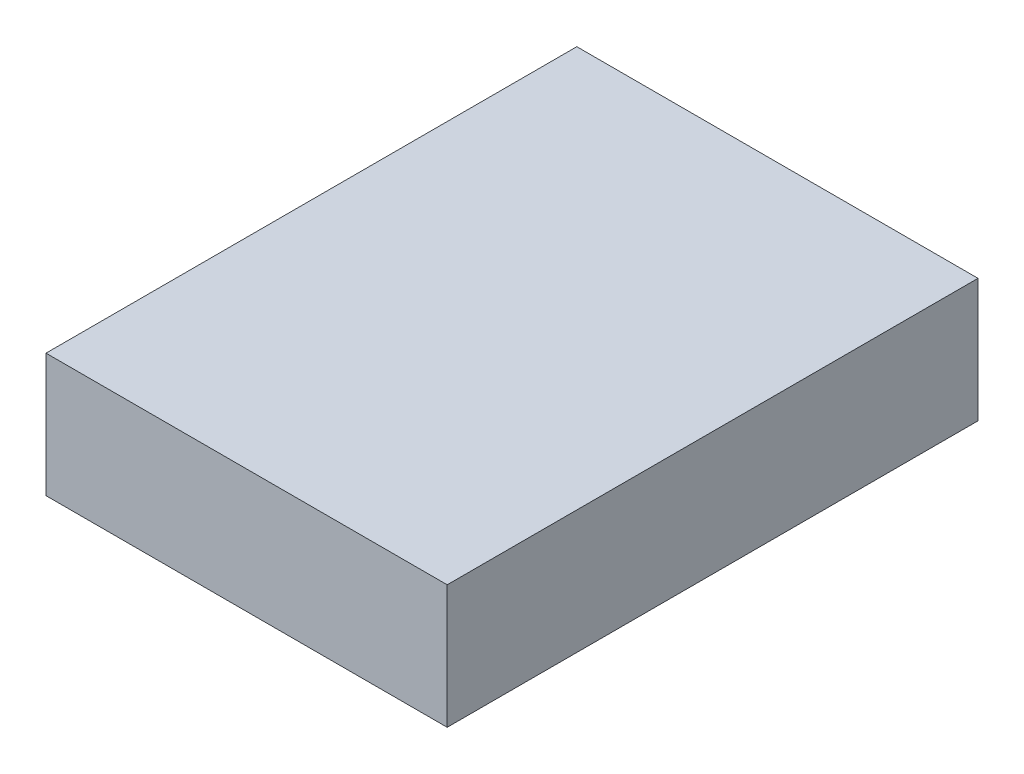
ISO-10303-21;
HEADER;
FILE_DESCRIPTION(('STEP AP214'),'2;1');
FILE_NAME('part.step','',(''),(''),'','','');
FILE_SCHEMA(('AUTOMOTIVE_DESIGN { 1 0 10303 214 1 1 1 1 }'));
ENDSEC;
DATA;
#1=APPLICATION_CONTEXT('core data for automotive mechanical design processes');
#2=APPLICATION_PROTOCOL_DEFINITION('international standard','automotive_design',2000,#1);
#3=PRODUCT_CONTEXT('',#1,'mechanical');
#4=PRODUCT('Part','Part','',(#3));
#5=PRODUCT_RELATED_PRODUCT_CATEGORY('part','',(#4));
#6=PRODUCT_DEFINITION_FORMATION('','',#4);
#7=PRODUCT_DEFINITION_CONTEXT('part definition',#1,'design');
#8=PRODUCT_DEFINITION('design','',#6,#7);
#9=PRODUCT_DEFINITION_SHAPE('','',#8);
#10=(LENGTH_UNIT() NAMED_UNIT(*) SI_UNIT(.MILLI.,.METRE.));
#11=(NAMED_UNIT(*) PLANE_ANGLE_UNIT() SI_UNIT($,.RADIAN.));
#12=(NAMED_UNIT(*) SI_UNIT($,.STERADIAN.) SOLID_ANGLE_UNIT());
#13=UNCERTAINTY_MEASURE_WITH_UNIT(LENGTH_MEASURE(1.E-05),#10,'distance_accuracy_value','');
#14=(GEOMETRIC_REPRESENTATION_CONTEXT(3) GLOBAL_UNCERTAINTY_ASSIGNED_CONTEXT((#13)) GLOBAL_UNIT_ASSIGNED_CONTEXT((#10,
#11,#12)) REPRESENTATION_CONTEXT('',''));
#15=CARTESIAN_POINT('',(0.,0.,0.));
#16=DIRECTION('',(0.,0.,1.));
#17=DIRECTION('',(1.,0.,0.));
#18=AXIS2_PLACEMENT_3D('',#15,#16,#17);
#19=CARTESIAN_POINT('',(6.8552,3.1756,-0.840000000000039));
#20=DIRECTION('',(1.,0.,0.));
#21=DIRECTION('',(0.,0.,-1.));
#22=AXIS2_PLACEMENT_3D('',#19,#20,#21);
#23=PLANE('',#22);
#24=DIRECTION('',(0.,0.,1.));
#25=VECTOR('',#24,1.);
#26=CARTESIAN_POINT('',(6.8552,2.9756,-0.840000000000039));
#27=LINE('',#26,#25);
#28=CARTESIAN_POINT('',(6.8552,2.9756,-1.7));
#29=VERTEX_POINT('',#28);
#30=CARTESIAN_POINT('',(6.8552,2.9756,-0.840000000000039));
#31=VERTEX_POINT('',#30);
#32=EDGE_CURVE('E11',#29,#31,#27,.T.);
#33=ORIENTED_EDGE('',*,*,#32,.T.);
#34=DIRECTION('',(0.,-1.,0.));
#35=VECTOR('',#34,1.);
#36=CARTESIAN_POINT('',(6.8552,3.1756,-0.840000000000039));
#37=LINE('',#36,#35);
#38=CARTESIAN_POINT('',(6.8552,3.1756,-0.840000000000039));
#39=VERTEX_POINT('',#38);
#40=EDGE_CURVE('E24',#39,#31,#37,.T.);
#41=ORIENTED_EDGE('',*,*,#40,.F.);
#42=DIRECTION('',(0.,0.,1.));
#43=VECTOR('',#42,1.);
#44=CARTESIAN_POINT('',(6.8552,3.1756,-0.840000000000039));
#45=LINE('',#44,#43);
#46=CARTESIAN_POINT('',(6.8552,3.1756,-1.7));
#47=VERTEX_POINT('',#46);
#48=EDGE_CURVE('E88',#47,#39,#45,.T.);
#49=ORIENTED_EDGE('',*,*,#48,.F.);
#50=DIRECTION('',(0.,-1.,0.));
#51=VECTOR('',#50,1.);
#52=CARTESIAN_POINT('',(6.8552,3.1756,-1.7));
#53=LINE('',#52,#51);
#54=EDGE_CURVE('E77',#47,#29,#53,.T.);
#55=ORIENTED_EDGE('',*,*,#54,.T.);
#56=EDGE_LOOP('',(#33,#41,#49,#55));
#57=FACE_BOUND('',#56,.T.);
#58=ADVANCED_FACE('F17',(#57),#23,.F.);
#59=CARTESIAN_POINT('',(6.8552,3.1756,-0.840000000000039));
#60=DIRECTION('',(0.,0.,-1.));
#61=DIRECTION('',(-1.,0.,0.));
#62=AXIS2_PLACEMENT_3D('',#59,#60,#61);
#63=PLANE('',#62);
#64=DIRECTION('',(1.,0.,0.));
#65=VECTOR('',#64,1.);
#66=CARTESIAN_POINT('',(6.8552,2.9756,-0.840000000000039));
#67=LINE('',#66,#65);
#68=CARTESIAN_POINT('',(7.5052,2.9756,-0.840000000000039));
#69=VERTEX_POINT('',#68);
#70=EDGE_CURVE('E85',#31,#69,#67,.T.);
#71=ORIENTED_EDGE('',*,*,#70,.T.);
#72=DIRECTION('',(0.,-1.,0.));
#73=VECTOR('',#72,1.);
#74=CARTESIAN_POINT('',(7.5052,3.1756,-0.840000000000039));
#75=LINE('',#74,#73);
#76=CARTESIAN_POINT('',(7.5052,3.1756,-0.840000000000039));
#77=VERTEX_POINT('',#76);
#78=EDGE_CURVE('E83',#77,#69,#75,.T.);
#79=ORIENTED_EDGE('',*,*,#78,.F.);
#80=DIRECTION('',(1.,0.,0.));
#81=VECTOR('',#80,1.);
#82=CARTESIAN_POINT('',(6.8552,3.1756,-0.840000000000039));
#83=LINE('',#82,#81);
#84=EDGE_CURVE('E72',#39,#77,#83,.T.);
#85=ORIENTED_EDGE('',*,*,#84,.F.);
#86=ORIENTED_EDGE('',*,*,#40,.T.);
#87=EDGE_LOOP('',(#71,#79,#85,#86));
#88=FACE_BOUND('',#87,.T.);
#89=ADVANCED_FACE('F90',(#88),#63,.F.);
#90=CARTESIAN_POINT('',(7.5052,3.1756,-0.840000000000039));
#91=DIRECTION('',(-1.,0.,0.));
#92=DIRECTION('',(0.,0.,1.));
#93=AXIS2_PLACEMENT_3D('',#90,#91,#92);
#94=PLANE('',#93);
#95=DIRECTION('',(0.,0.,-1.));
#96=VECTOR('',#95,1.);
#97=CARTESIAN_POINT('',(7.5052,2.9756,-0.840000000000039));
#98=LINE('',#97,#96);
#99=CARTESIAN_POINT('',(7.5052,2.9756,-1.7));
#100=VERTEX_POINT('',#99);
#101=EDGE_CURVE('E60',#69,#100,#98,.T.);
#102=ORIENTED_EDGE('',*,*,#101,.T.);
#103=DIRECTION('',(0.,-1.,0.));
#104=VECTOR('',#103,1.);
#105=CARTESIAN_POINT('',(7.5052,3.1756,-1.7));
#106=LINE('',#105,#104);
#107=CARTESIAN_POINT('',(7.5052,3.1756,-1.7));
#108=VERTEX_POINT('',#107);
#109=EDGE_CURVE('E54',#108,#100,#106,.T.);
#110=ORIENTED_EDGE('',*,*,#109,.F.);
#111=DIRECTION('',(0.,0.,-1.));
#112=VECTOR('',#111,1.);
#113=CARTESIAN_POINT('',(7.5052,3.1756,-0.840000000000039));
#114=LINE('',#113,#112);
#115=EDGE_CURVE('E58',#77,#108,#114,.T.);
#116=ORIENTED_EDGE('',*,*,#115,.F.);
#117=ORIENTED_EDGE('',*,*,#78,.T.);
#118=EDGE_LOOP('',(#102,#110,#116,#117));
#119=FACE_BOUND('',#118,.T.);
#120=ADVANCED_FACE('F56',(#119),#94,.F.);
#121=CARTESIAN_POINT('',(6.8552,3.1756,-1.7));
#122=DIRECTION('',(0.,0.,1.));
#123=DIRECTION('',(1.,0.,0.));
#124=AXIS2_PLACEMENT_3D('',#121,#122,#123);
#125=PLANE('',#124);
#126=DIRECTION('',(-1.,0.,0.));
#127=VECTOR('',#126,1.);
#128=CARTESIAN_POINT('',(6.8552,2.9756,-1.7));
#129=LINE('',#128,#127);
#130=EDGE_CURVE('E73',#100,#29,#129,.T.);
#131=ORIENTED_EDGE('',*,*,#130,.T.);
#132=ORIENTED_EDGE('',*,*,#54,.F.);
#133=DIRECTION('',(-1.,0.,0.));
#134=VECTOR('',#133,1.);
#135=CARTESIAN_POINT('',(6.8552,3.1756,-1.7));
#136=LINE('',#135,#134);
#137=EDGE_CURVE('E70',#108,#47,#136,.T.);
#138=ORIENTED_EDGE('',*,*,#137,.F.);
#139=ORIENTED_EDGE('',*,*,#109,.T.);
#140=EDGE_LOOP('',(#131,#132,#138,#139));
#141=FACE_BOUND('',#140,.T.);
#142=ADVANCED_FACE('F76',(#141),#125,.F.);
#143=CARTESIAN_POINT('',(6.6802,3.1756,-1.27));
#144=DIRECTION('',(0.,-1.,0.));
#145=DIRECTION('',(0.,0.,-1.));
#146=AXIS2_PLACEMENT_3D('',#143,#144,#145);
#147=PLANE('',#146);
#148=ORIENTED_EDGE('',*,*,#48,.T.);
#149=ORIENTED_EDGE('',*,*,#84,.T.);
#150=ORIENTED_EDGE('',*,*,#115,.T.);
#151=ORIENTED_EDGE('',*,*,#137,.T.);
#152=EDGE_LOOP('',(#148,#149,#150,#151));
#153=FACE_BOUND('',#152,.T.);
#154=ADVANCED_FACE('F69',(#153),#147,.F.);
#155=CARTESIAN_POINT('',(6.6802,2.9756,-1.27));
#156=DIRECTION('',(0.,-1.,0.));
#157=DIRECTION('',(0.,0.,-1.));
#158=AXIS2_PLACEMENT_3D('',#155,#156,#157);
#159=PLANE('',#158);
#160=ORIENTED_EDGE('',*,*,#32,.F.);
#161=ORIENTED_EDGE('',*,*,#130,.F.);
#162=ORIENTED_EDGE('',*,*,#101,.F.);
#163=ORIENTED_EDGE('',*,*,#70,.F.);
#164=EDGE_LOOP('',(#160,#161,#162,#163));
#165=FACE_BOUND('',#164,.T.);
#166=ADVANCED_FACE('F91',(#165),#159,.T.);
#167=CLOSED_SHELL('',(#58,#89,#120,#142,#154,#166));
#168=MANIFOLD_SOLID_BREP('B1',#167);
#169=ADVANCED_BREP_SHAPE_REPRESENTATION('',(#18,#168),#14);
#170=SHAPE_DEFINITION_REPRESENTATION(#9,#169);
ENDSEC;
END-ISO-10303-21;
